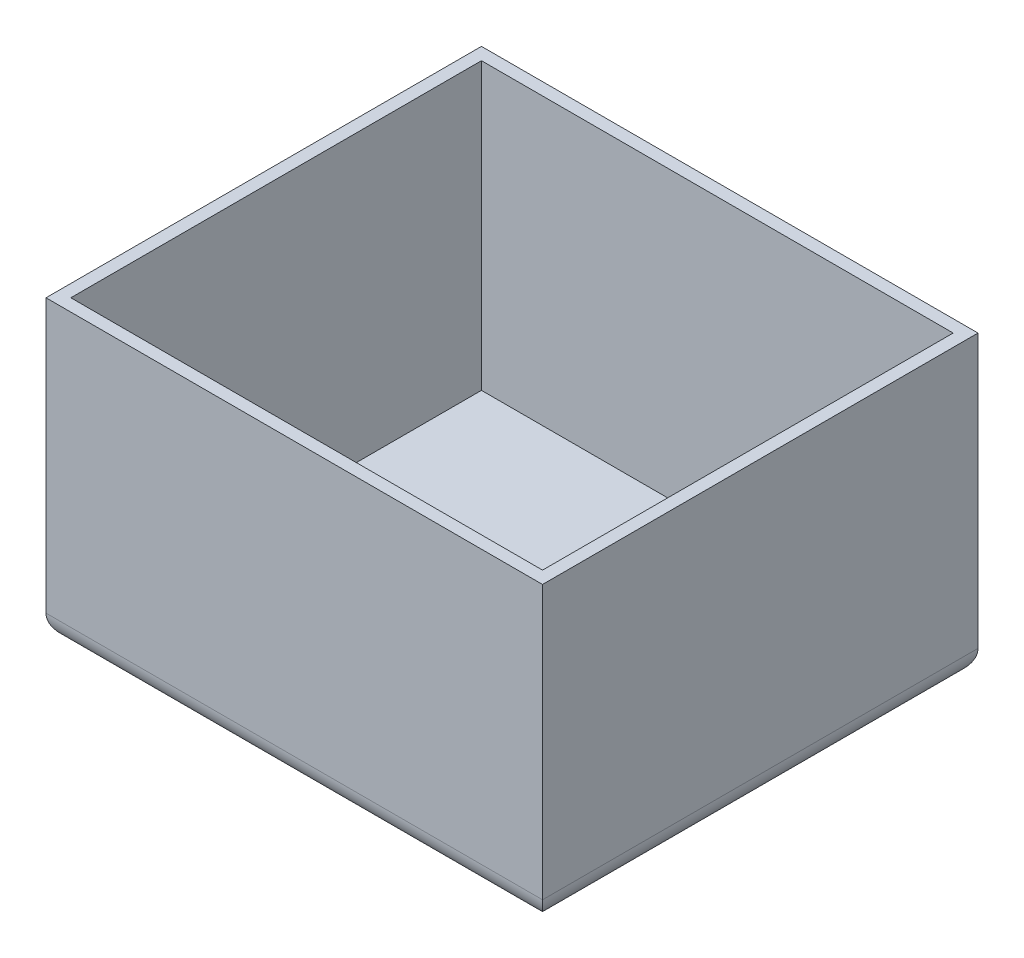
ISO-10303-21;
HEADER;
FILE_DESCRIPTION(('STEP AP214'),'2;1');
FILE_NAME('part.step','',(''),(''),'','','');
FILE_SCHEMA(('AUTOMOTIVE_DESIGN { 1 0 10303 214 1 1 1 1 }'));
ENDSEC;
DATA;
#1=APPLICATION_CONTEXT('core data for automotive mechanical design processes');
#2=APPLICATION_PROTOCOL_DEFINITION('international standard','automotive_design',2000,#1);
#3=PRODUCT_CONTEXT('',#1,'mechanical');
#4=PRODUCT('Part','Part','',(#3));
#5=PRODUCT_RELATED_PRODUCT_CATEGORY('part','',(#4));
#6=PRODUCT_DEFINITION_FORMATION('','',#4);
#7=PRODUCT_DEFINITION_CONTEXT('part definition',#1,'design');
#8=PRODUCT_DEFINITION('design','',#6,#7);
#9=PRODUCT_DEFINITION_SHAPE('','',#8);
#10=(LENGTH_UNIT() NAMED_UNIT(*) SI_UNIT(.MILLI.,.METRE.));
#11=(NAMED_UNIT(*) PLANE_ANGLE_UNIT() SI_UNIT($,.RADIAN.));
#12=(NAMED_UNIT(*) SI_UNIT($,.STERADIAN.) SOLID_ANGLE_UNIT());
#13=UNCERTAINTY_MEASURE_WITH_UNIT(LENGTH_MEASURE(1.E-05),#10,'distance_accuracy_value','');
#14=(GEOMETRIC_REPRESENTATION_CONTEXT(3) GLOBAL_UNCERTAINTY_ASSIGNED_CONTEXT((#13)) GLOBAL_UNIT_ASSIGNED_CONTEXT((#10,
#11,#12)) REPRESENTATION_CONTEXT('',''));
#15=CARTESIAN_POINT('',(0.,0.,0.));
#16=DIRECTION('',(0.,0.,1.));
#17=DIRECTION('',(1.,0.,0.));
#18=AXIS2_PLACEMENT_3D('',#15,#16,#17);
#19=CARTESIAN_POINT('',(0.,120.,175.4));
#20=DIRECTION('',(0.,-1.,0.));
#21=DIRECTION('',(0.,0.,-1.));
#22=AXIS2_PLACEMENT_3D('',#19,#20,#21);
#23=PLANE('',#22);
#24=DIRECTION('',(-1.,0.,0.));
#25=VECTOR('',#24,1.);
#26=CARTESIAN_POINT('',(0.,120.,0.));
#27=LINE('',#26,#25);
#28=CARTESIAN_POINT('',(200.,120.,0.));
#29=VERTEX_POINT('',#28);
#30=CARTESIAN_POINT('',(0.,120.,0.));
#31=VERTEX_POINT('',#30);
#32=EDGE_CURVE('E281',#29,#31,#27,.T.);
#33=ORIENTED_EDGE('',*,*,#32,.T.);
#34=DIRECTION('',(0.,0.,-1.));
#35=VECTOR('',#34,1.);
#36=CARTESIAN_POINT('',(0.,120.,175.4));
#37=LINE('',#36,#35);
#38=CARTESIAN_POINT('',(0.,120.,175.4));
#39=VERTEX_POINT('',#38);
#40=EDGE_CURVE('E285',#39,#31,#37,.T.);
#41=ORIENTED_EDGE('',*,*,#40,.F.);
#42=DIRECTION('',(-1.,0.,0.));
#43=VECTOR('',#42,1.);
#44=CARTESIAN_POINT('',(0.,120.,175.4));
#45=LINE('',#44,#43);
#46=CARTESIAN_POINT('',(200.,120.,175.4));
#47=VERTEX_POINT('',#46);
#48=EDGE_CURVE('E283',#47,#39,#45,.T.);
#49=ORIENTED_EDGE('',*,*,#48,.F.);
#50=DIRECTION('',(0.,0.,-1.));
#51=VECTOR('',#50,1.);
#52=CARTESIAN_POINT('',(200.,120.,175.4));
#53=LINE('',#52,#51);
#54=EDGE_CURVE('E293',#47,#29,#53,.T.);
#55=ORIENTED_EDGE('',*,*,#54,.T.);
#56=EDGE_LOOP('',(#33,#41,#49,#55));
#57=FACE_BOUND('',#56,.T.);
#58=DIRECTION('',(-1.,0.,0.));
#59=VECTOR('',#58,1.);
#60=CARTESIAN_POINT('',(0.,120.,5.));
#61=LINE('',#60,#59);
#62=CARTESIAN_POINT('',(195.,120.,5.));
#63=VERTEX_POINT('',#62);
#64=CARTESIAN_POINT('',(5.,120.,5.));
#65=VERTEX_POINT('',#64);
#66=EDGE_CURVE('E257',#63,#65,#61,.T.);
#67=ORIENTED_EDGE('',*,*,#66,.F.);
#68=DIRECTION('',(0.,0.,-1.));
#69=VECTOR('',#68,1.);
#70=CARTESIAN_POINT('',(195.,120.,175.4));
#71=LINE('',#70,#69);
#72=CARTESIAN_POINT('',(195.,120.,170.4));
#73=VERTEX_POINT('',#72);
#74=EDGE_CURVE('E262',#73,#63,#71,.T.);
#75=ORIENTED_EDGE('',*,*,#74,.F.);
#76=DIRECTION('',(-1.,0.,0.));
#77=VECTOR('',#76,1.);
#78=CARTESIAN_POINT('',(0.,120.,170.4));
#79=LINE('',#78,#77);
#80=CARTESIAN_POINT('',(5.,120.,170.4));
#81=VERTEX_POINT('',#80);
#82=EDGE_CURVE('E268',#73,#81,#79,.T.);
#83=ORIENTED_EDGE('',*,*,#82,.T.);
#84=DIRECTION('',(0.,0.,-1.));
#85=VECTOR('',#84,1.);
#86=CARTESIAN_POINT('',(5.,120.,175.4));
#87=LINE('',#86,#85);
#88=EDGE_CURVE('E269',#81,#65,#87,.T.);
#89=ORIENTED_EDGE('',*,*,#88,.T.);
#90=EDGE_LOOP('',(#67,#75,#83,#89));
#91=FACE_BOUND('',#90,.T.);
#92=ADVANCED_FACE('F41',(#57,#91),#23,.F.);
#93=CARTESIAN_POINT('',(0.,0.,175.4));
#94=DIRECTION('',(1.,0.,0.));
#95=DIRECTION('',(0.,0.,-1.));
#96=AXIS2_PLACEMENT_3D('',#93,#94,#95);
#97=PLANE('',#96);
#98=DIRECTION('',(0.,-1.,0.));
#99=VECTOR('',#98,1.);
#100=CARTESIAN_POINT('',(0.,0.,0.));
#101=LINE('',#100,#99);
#102=CARTESIAN_POINT('',(0.,10.,0.));
#103=VERTEX_POINT('',#102);
#104=EDGE_CURVE('E251',#31,#103,#101,.T.);
#105=ORIENTED_EDGE('',*,*,#104,.T.);
#106=DIRECTION('',(0.,0.,-1.));
#107=VECTOR('',#106,1.);
#108=CARTESIAN_POINT('',(0.,10.,175.4));
#109=LINE('',#108,#107);
#110=CARTESIAN_POINT('',(0.,10.,175.4));
#111=VERTEX_POINT('',#110);
#112=EDGE_CURVE('E319',#103,#111,#109,.F.);
#113=ORIENTED_EDGE('',*,*,#112,.T.);
#114=DIRECTION('',(0.,-1.,0.));
#115=VECTOR('',#114,1.);
#116=CARTESIAN_POINT('',(0.,0.,175.4));
#117=LINE('',#116,#115);
#118=EDGE_CURVE('E277',#39,#111,#117,.T.);
#119=ORIENTED_EDGE('',*,*,#118,.F.);
#120=ORIENTED_EDGE('',*,*,#40,.T.);
#121=EDGE_LOOP('',(#105,#113,#119,#120));
#122=FACE_BOUND('',#121,.T.);
#123=ADVANCED_FACE('F419',(#122),#97,.F.);
#124=CARTESIAN_POINT('',(0.,0.,175.4));
#125=DIRECTION('',(0.,1.,0.));
#126=DIRECTION('',(0.,0.,1.));
#127=AXIS2_PLACEMENT_3D('',#124,#125,#126);
#128=PLANE('',#127);
#129=DIRECTION('',(1.,0.,0.));
#130=VECTOR('',#129,1.);
#131=CARTESIAN_POINT('',(0.,0.,165.4));
#132=LINE('',#131,#130);
#133=CARTESIAN_POINT('',(190.,0.,165.4));
#134=VERTEX_POINT('',#133);
#135=CARTESIAN_POINT('',(10.,0.,165.4));
#136=VERTEX_POINT('',#135);
#137=EDGE_CURVE('E314',#134,#136,#132,.F.);
#138=ORIENTED_EDGE('',*,*,#137,.T.);
#139=DIRECTION('',(0.,0.,-1.));
#140=VECTOR('',#139,1.);
#141=CARTESIAN_POINT('',(10.,0.,175.4));
#142=LINE('',#141,#140);
#143=CARTESIAN_POINT('',(10.,0.,10.));
#144=VERTEX_POINT('',#143);
#145=EDGE_CURVE('E316',#136,#144,#142,.T.);
#146=ORIENTED_EDGE('',*,*,#145,.T.);
#147=DIRECTION('',(1.,0.,0.));
#148=VECTOR('',#147,1.);
#149=CARTESIAN_POINT('',(200.,0.,10.));
#150=LINE('',#149,#148);
#151=CARTESIAN_POINT('',(190.,0.,10.));
#152=VERTEX_POINT('',#151);
#153=EDGE_CURVE('E310',#144,#152,#150,.T.);
#154=ORIENTED_EDGE('',*,*,#153,.T.);
#155=DIRECTION('',(0.,0.,-1.));
#156=VECTOR('',#155,1.);
#157=CARTESIAN_POINT('',(190.,0.,175.4));
#158=LINE('',#157,#156);
#159=EDGE_CURVE('E312',#152,#134,#158,.F.);
#160=ORIENTED_EDGE('',*,*,#159,.T.);
#161=EDGE_LOOP('',(#138,#146,#154,#160));
#162=FACE_BOUND('',#161,.T.);
#163=DIRECTION('',(0.,0.,1.));
#164=VECTOR('',#163,1.);
#165=CARTESIAN_POINT('',(142.542212692304,0.,82.4026280979061));
#166=LINE('',#165,#164);
#167=CARTESIAN_POINT('',(142.542212692304,0.,103.514603163571));
#168=VERTEX_POINT('',#167);
#169=CARTESIAN_POINT('',(142.542212692304,0.,72.4026280979061));
#170=VERTEX_POINT('',#169);
#171=EDGE_CURVE('E305',#168,#170,#166,.F.);
#172=ORIENTED_EDGE('',*,*,#171,.T.);
#173=DIRECTION('',(1.,0.,0.));
#174=VECTOR('',#173,1.);
#175=CARTESIAN_POINT('',(66.6640748030059,0.,72.4026280979061));
#176=LINE('',#175,#174);
#177=CARTESIAN_POINT('',(56.6640748030059,0.,72.4026280979061));
#178=VERTEX_POINT('',#177);
#179=EDGE_CURVE('E307',#170,#178,#176,.F.);
#180=ORIENTED_EDGE('',*,*,#179,.T.);
#181=DIRECTION('',(0.,0.,1.));
#182=VECTOR('',#181,1.);
#183=CARTESIAN_POINT('',(56.6640748030059,0.,175.4));
#184=LINE('',#183,#182);
#185=CARTESIAN_POINT('',(56.6640748030059,0.,103.514603163571));
#186=VERTEX_POINT('',#185);
#187=EDGE_CURVE('E301',#178,#186,#184,.T.);
#188=ORIENTED_EDGE('',*,*,#187,.T.);
#189=DIRECTION('',(1.,0.,0.));
#190=VECTOR('',#189,1.);
#191=CARTESIAN_POINT('',(0.,0.,103.514603163571));
#192=LINE('',#191,#190);
#193=EDGE_CURVE('E303',#186,#168,#192,.T.);
#194=ORIENTED_EDGE('',*,*,#193,.T.);
#195=EDGE_LOOP('',(#172,#180,#188,#194));
#196=FACE_BOUND('',#195,.T.);
#197=ADVANCED_FACE('F381',(#162,#196),#128,.F.);
#198=CARTESIAN_POINT('',(200.,0.,175.4));
#199=DIRECTION('',(-1.,0.,0.));
#200=DIRECTION('',(0.,0.,1.));
#201=AXIS2_PLACEMENT_3D('',#198,#199,#200);
#202=PLANE('',#201);
#203=DIRECTION('',(0.,1.,0.));
#204=VECTOR('',#203,1.);
#205=CARTESIAN_POINT('',(200.,0.,175.4));
#206=LINE('',#205,#204);
#207=CARTESIAN_POINT('',(200.,10.,175.4));
#208=VERTEX_POINT('',#207);
#209=EDGE_CURVE('E280',#208,#47,#206,.T.);
#210=ORIENTED_EDGE('',*,*,#209,.F.);
#211=DIRECTION('',(0.,0.,-1.));
#212=VECTOR('',#211,1.);
#213=CARTESIAN_POINT('',(200.,10.,175.4));
#214=LINE('',#213,#212);
#215=CARTESIAN_POINT('',(200.,10.,0.));
#216=VERTEX_POINT('',#215);
#217=EDGE_CURVE('E324',#208,#216,#214,.T.);
#218=ORIENTED_EDGE('',*,*,#217,.T.);
#219=DIRECTION('',(0.,1.,0.));
#220=VECTOR('',#219,1.);
#221=CARTESIAN_POINT('',(200.,0.,0.));
#222=LINE('',#221,#220);
#223=EDGE_CURVE('E288',#216,#29,#222,.T.);
#224=ORIENTED_EDGE('',*,*,#223,.T.);
#225=ORIENTED_EDGE('',*,*,#54,.F.);
#226=EDGE_LOOP('',(#210,#218,#224,#225));
#227=FACE_BOUND('',#226,.T.);
#228=ADVANCED_FACE('F432',(#227),#202,.F.);
#229=CARTESIAN_POINT('',(0.,0.,175.4));
#230=DIRECTION('',(0.,0.,-1.));
#231=DIRECTION('',(-1.,0.,0.));
#232=AXIS2_PLACEMENT_3D('',#229,#230,#231);
#233=PLANE('',#232);
#234=ORIENTED_EDGE('',*,*,#118,.T.);
#235=DIRECTION('',(1.,0.,0.));
#236=VECTOR('',#235,1.);
#237=CARTESIAN_POINT('',(0.,10.,175.4));
#238=LINE('',#237,#236);
#239=EDGE_CURVE('E322',#111,#208,#238,.T.);
#240=ORIENTED_EDGE('',*,*,#239,.T.);
#241=ORIENTED_EDGE('',*,*,#209,.T.);
#242=ORIENTED_EDGE('',*,*,#48,.T.);
#243=EDGE_LOOP('',(#234,#240,#241,#242));
#244=FACE_BOUND('',#243,.T.);
#245=ADVANCED_FACE('F435',(#244),#233,.F.);
#246=CARTESIAN_POINT('',(0.,0.,0.));
#247=DIRECTION('',(0.,0.,-1.));
#248=DIRECTION('',(-1.,0.,0.));
#249=AXIS2_PLACEMENT_3D('',#246,#247,#248);
#250=PLANE('',#249);
#251=ORIENTED_EDGE('',*,*,#223,.F.);
#252=DIRECTION('',(1.,0.,0.));
#253=VECTOR('',#252,1.);
#254=CARTESIAN_POINT('',(0.,10.,0.));
#255=LINE('',#254,#253);
#256=EDGE_CURVE('E326',#216,#103,#255,.F.);
#257=ORIENTED_EDGE('',*,*,#256,.T.);
#258=ORIENTED_EDGE('',*,*,#104,.F.);
#259=ORIENTED_EDGE('',*,*,#32,.F.);
#260=EDGE_LOOP('',(#251,#257,#258,#259));
#261=FACE_BOUND('',#260,.T.);
#262=ADVANCED_FACE('F430',(#261),#250,.T.);
#263=CARTESIAN_POINT('',(5.,0.,175.4));
#264=DIRECTION('',(1.,0.,0.));
#265=DIRECTION('',(0.,0.,-1.));
#266=AXIS2_PLACEMENT_3D('',#263,#264,#265);
#267=PLANE('',#266);
#268=DIRECTION('',(0.,-1.,0.));
#269=VECTOR('',#268,1.);
#270=CARTESIAN_POINT('',(5.,0.,5.));
#271=LINE('',#270,#269);
#272=CARTESIAN_POINT('',(5.,5.,5.));
#273=VERTEX_POINT('',#272);
#274=EDGE_CURVE('E237',#65,#273,#271,.T.);
#275=ORIENTED_EDGE('',*,*,#274,.F.);
#276=ORIENTED_EDGE('',*,*,#88,.F.);
#277=DIRECTION('',(0.,-1.,0.));
#278=VECTOR('',#277,1.);
#279=CARTESIAN_POINT('',(5.,0.,170.4));
#280=LINE('',#279,#278);
#281=CARTESIAN_POINT('',(5.,5.,170.4));
#282=VERTEX_POINT('',#281);
#283=EDGE_CURVE('E253',#81,#282,#280,.T.);
#284=ORIENTED_EDGE('',*,*,#283,.T.);
#285=DIRECTION('',(0.,0.,-1.));
#286=VECTOR('',#285,1.);
#287=CARTESIAN_POINT('',(5.,5.,175.4));
#288=LINE('',#287,#286);
#289=EDGE_CURVE('E248',#282,#273,#288,.T.);
#290=ORIENTED_EDGE('',*,*,#289,.T.);
#291=EDGE_LOOP('',(#275,#276,#284,#290));
#292=FACE_BOUND('',#291,.T.);
#293=ADVANCED_FACE('F551',(#292),#267,.T.);
#294=CARTESIAN_POINT('',(0.,5.,175.4));
#295=DIRECTION('',(0.,1.,0.));
#296=DIRECTION('',(0.,0.,1.));
#297=AXIS2_PLACEMENT_3D('',#294,#295,#296);
#298=PLANE('',#297);
#299=DIRECTION('',(1.,0.,0.));
#300=VECTOR('',#299,1.);
#301=CARTESIAN_POINT('',(0.,5.,5.));
#302=LINE('',#301,#300);
#303=CARTESIAN_POINT('',(195.,5.,5.));
#304=VERTEX_POINT('',#303);
#305=EDGE_CURVE('E247',#273,#304,#302,.T.);
#306=ORIENTED_EDGE('',*,*,#305,.F.);
#307=ORIENTED_EDGE('',*,*,#289,.F.);
#308=DIRECTION('',(1.,0.,0.));
#309=VECTOR('',#308,1.);
#310=CARTESIAN_POINT('',(0.,5.,170.4));
#311=LINE('',#310,#309);
#312=CARTESIAN_POINT('',(195.,5.,170.4));
#313=VERTEX_POINT('',#312);
#314=EDGE_CURVE('E256',#282,#313,#311,.T.);
#315=ORIENTED_EDGE('',*,*,#314,.T.);
#316=DIRECTION('',(0.,0.,-1.));
#317=VECTOR('',#316,1.);
#318=CARTESIAN_POINT('',(195.,5.,175.4));
#319=LINE('',#318,#317);
#320=EDGE_CURVE('E252',#313,#304,#319,.T.);
#321=ORIENTED_EDGE('',*,*,#320,.T.);
#322=EDGE_LOOP('',(#306,#307,#315,#321));
#323=FACE_BOUND('',#322,.T.);
#324=ADVANCED_FACE('F588',(#323),#298,.T.);
#325=CARTESIAN_POINT('',(195.,0.,175.4));
#326=DIRECTION('',(-1.,0.,0.));
#327=DIRECTION('',(0.,0.,1.));
#328=AXIS2_PLACEMENT_3D('',#325,#326,#327);
#329=PLANE('',#328);
#330=DIRECTION('',(0.,1.,0.));
#331=VECTOR('',#330,1.);
#332=CARTESIAN_POINT('',(195.,0.,5.));
#333=LINE('',#332,#331);
#334=EDGE_CURVE('E259',#304,#63,#333,.T.);
#335=ORIENTED_EDGE('',*,*,#334,.F.);
#336=ORIENTED_EDGE('',*,*,#320,.F.);
#337=DIRECTION('',(0.,1.,0.));
#338=VECTOR('',#337,1.);
#339=CARTESIAN_POINT('',(195.,0.,170.4));
#340=LINE('',#339,#338);
#341=EDGE_CURVE('E264',#313,#73,#340,.T.);
#342=ORIENTED_EDGE('',*,*,#341,.T.);
#343=ORIENTED_EDGE('',*,*,#74,.T.);
#344=EDGE_LOOP('',(#335,#336,#342,#343));
#345=FACE_BOUND('',#344,.T.);
#346=ADVANCED_FACE('F598',(#345),#329,.T.);
#347=CARTESIAN_POINT('',(0.,0.,170.4));
#348=DIRECTION('',(0.,0.,-1.));
#349=DIRECTION('',(-1.,0.,0.));
#350=AXIS2_PLACEMENT_3D('',#347,#348,#349);
#351=PLANE('',#350);
#352=ORIENTED_EDGE('',*,*,#283,.F.);
#353=ORIENTED_EDGE('',*,*,#82,.F.);
#354=ORIENTED_EDGE('',*,*,#341,.F.);
#355=ORIENTED_EDGE('',*,*,#314,.F.);
#356=EDGE_LOOP('',(#352,#353,#354,#355));
#357=FACE_BOUND('',#356,.T.);
#358=ADVANCED_FACE('F608',(#357),#351,.T.);
#359=CARTESIAN_POINT('',(0.,0.,5.));
#360=DIRECTION('',(0.,0.,-1.));
#361=DIRECTION('',(-1.,0.,0.));
#362=AXIS2_PLACEMENT_3D('',#359,#360,#361);
#363=PLANE('',#362);
#364=ORIENTED_EDGE('',*,*,#274,.T.);
#365=ORIENTED_EDGE('',*,*,#305,.T.);
#366=ORIENTED_EDGE('',*,*,#334,.T.);
#367=ORIENTED_EDGE('',*,*,#66,.T.);
#368=EDGE_LOOP('',(#364,#365,#366,#367));
#369=FACE_BOUND('',#368,.T.);
#370=ADVANCED_FACE('F541',(#369),#363,.F.);
#371=CARTESIAN_POINT('',(66.6640748030059,-25.,93.5146031635708));
#372=DIRECTION('',(0.,0.,1.));
#373=DIRECTION('',(1.,0.,0.));
#374=AXIS2_PLACEMENT_3D('',#371,#372,#373);
#375=PLANE('',#374);
#376=DIRECTION('',(0.,1.,0.));
#377=VECTOR('',#376,1.);
#378=CARTESIAN_POINT('',(132.542212692304,-25.,93.5146031635708));
#379=LINE('',#378,#377);
#380=CARTESIAN_POINT('',(132.542212692304,-25.,93.5146031635708));
#381=VERTEX_POINT('',#380);
#382=CARTESIAN_POINT('',(132.542212692304,-10.,93.5146031635708));
#383=VERTEX_POINT('',#382);
#384=EDGE_CURVE('E233',#381,#383,#379,.T.);
#385=ORIENTED_EDGE('',*,*,#384,.T.);
#386=DIRECTION('',(1.,0.,0.));
#387=VECTOR('',#386,1.);
#388=CARTESIAN_POINT('',(66.6640748030059,-10.,93.5146031635708));
#389=LINE('',#388,#387);
#390=CARTESIAN_POINT('',(128.582824740776,-10.,93.5146031635708));
#391=VERTEX_POINT('',#390);
#392=EDGE_CURVE('E216',#383,#391,#389,.F.);
#393=ORIENTED_EDGE('',*,*,#392,.T.);
#394=DIRECTION('',(0.,1.,0.));
#395=VECTOR('',#394,1.);
#396=CARTESIAN_POINT('',(128.582824740776,-3.71555235478723,93.5146031635708));
#397=LINE('',#396,#395);
#398=CARTESIAN_POINT('',(128.582824740776,-20.0767554822657,93.5146031635708));
#399=VERTEX_POINT('',#398);
#400=EDGE_CURVE('E195',#399,#391,#397,.T.);
#401=ORIENTED_EDGE('',*,*,#400,.F.);
#402=DIRECTION('',(1.,0.,0.));
#403=VECTOR('',#402,1.);
#404=CARTESIAN_POINT('',(70.8258064714842,-20.0767554822657,93.5146031635708));
#405=LINE('',#404,#403);
#406=CARTESIAN_POINT('',(70.8258064714842,-20.0767554822657,93.5146031635708));
#407=VERTEX_POINT('',#406);
#408=EDGE_CURVE('E206',#407,#399,#405,.T.);
#409=ORIENTED_EDGE('',*,*,#408,.F.);
#410=DIRECTION('',(0.,-1.,0.));
#411=VECTOR('',#410,1.);
#412=CARTESIAN_POINT('',(70.8258064714842,-3.71555235478723,93.5146031635708));
#413=LINE('',#412,#411);
#414=CARTESIAN_POINT('',(70.8258064714842,-10.,93.5146031635708));
#415=VERTEX_POINT('',#414);
#416=EDGE_CURVE('E211',#415,#407,#413,.T.);
#417=ORIENTED_EDGE('',*,*,#416,.F.);
#418=DIRECTION('',(1.,0.,0.));
#419=VECTOR('',#418,1.);
#420=CARTESIAN_POINT('',(66.6640748030059,-10.,93.5146031635708));
#421=LINE('',#420,#419);
#422=CARTESIAN_POINT('',(66.6640748030059,-10.,93.5146031635708));
#423=VERTEX_POINT('',#422);
#424=EDGE_CURVE('E335',#415,#423,#421,.F.);
#425=ORIENTED_EDGE('',*,*,#424,.T.);
#426=DIRECTION('',(0.,1.,0.));
#427=VECTOR('',#426,1.);
#428=CARTESIAN_POINT('',(66.6640748030059,-25.,93.5146031635708));
#429=LINE('',#428,#427);
#430=CARTESIAN_POINT('',(66.6640748030059,-25.,93.5146031635708));
#431=VERTEX_POINT('',#430);
#432=EDGE_CURVE('E234',#431,#423,#429,.T.);
#433=ORIENTED_EDGE('',*,*,#432,.F.);
#434=DIRECTION('',(1.,0.,0.));
#435=VECTOR('',#434,1.);
#436=CARTESIAN_POINT('',(66.6640748030059,-25.,93.5146031635708));
#437=LINE('',#436,#435);
#438=EDGE_CURVE('E222',#431,#381,#437,.T.);
#439=ORIENTED_EDGE('',*,*,#438,.T.);
#440=EDGE_LOOP('',(#385,#393,#401,#409,#417,#425,#433,#439));
#441=FACE_BOUND('',#440,.T.);
#442=ADVANCED_FACE('F214',(#441),#375,.T.);
#443=CARTESIAN_POINT('',(66.6640748030059,-25.,82.4026280979061));
#444=DIRECTION('',(-1.,0.,0.));
#445=DIRECTION('',(0.,0.,1.));
#446=AXIS2_PLACEMENT_3D('',#443,#444,#445);
#447=PLANE('',#446);
#448=ORIENTED_EDGE('',*,*,#432,.T.);
#449=DIRECTION('',(0.,0.,1.));
#450=VECTOR('',#449,1.);
#451=CARTESIAN_POINT('',(66.6640748030059,-10.,82.4026280979061));
#452=LINE('',#451,#450);
#453=CARTESIAN_POINT('',(66.6640748030059,-10.,82.4026280979061));
#454=VERTEX_POINT('',#453);
#455=EDGE_CURVE('E338',#423,#454,#452,.F.);
#456=ORIENTED_EDGE('',*,*,#455,.T.);
#457=DIRECTION('',(0.,1.,0.));
#458=VECTOR('',#457,1.);
#459=CARTESIAN_POINT('',(66.6640748030059,-25.,82.4026280979061));
#460=LINE('',#459,#458);
#461=CARTESIAN_POINT('',(66.6640748030059,-25.,82.4026280979061));
#462=VERTEX_POINT('',#461);
#463=EDGE_CURVE('E238',#462,#454,#460,.T.);
#464=ORIENTED_EDGE('',*,*,#463,.F.);
#465=DIRECTION('',(0.,0.,1.));
#466=VECTOR('',#465,1.);
#467=CARTESIAN_POINT('',(66.6640748030059,-25.,82.4026280979061));
#468=LINE('',#467,#466);
#469=EDGE_CURVE('E230',#462,#431,#468,.T.);
#470=ORIENTED_EDGE('',*,*,#469,.T.);
#471=EDGE_LOOP('',(#448,#456,#464,#470));
#472=FACE_BOUND('',#471,.T.);
#473=ADVANCED_FACE('F405',(#472),#447,.T.);
#474=CARTESIAN_POINT('',(66.6640748030059,-25.,82.4026280979061));
#475=DIRECTION('',(0.,0.,1.));
#476=DIRECTION('',(1.,0.,0.));
#477=AXIS2_PLACEMENT_3D('',#474,#475,#476);
#478=PLANE('',#477);
#479=ORIENTED_EDGE('',*,*,#463,.T.);
#480=DIRECTION('',(1.,0.,0.));
#481=VECTOR('',#480,1.);
#482=CARTESIAN_POINT('',(132.542212692304,-10.,82.4026280979061));
#483=LINE('',#482,#481);
#484=CARTESIAN_POINT('',(70.8258064714842,-10.,82.4026280979061));
#485=VERTEX_POINT('',#484);
#486=EDGE_CURVE('E330',#454,#485,#483,.T.);
#487=ORIENTED_EDGE('',*,*,#486,.T.);
#488=DIRECTION('',(0.,-1.,0.));
#489=VECTOR('',#488,1.);
#490=CARTESIAN_POINT('',(70.8258064714842,-25.,82.4026280979061));
#491=LINE('',#490,#489);
#492=CARTESIAN_POINT('',(70.8258064714842,-20.0767554822657,82.4026280979061));
#493=VERTEX_POINT('',#492);
#494=EDGE_CURVE('E299',#485,#493,#491,.T.);
#495=ORIENTED_EDGE('',*,*,#494,.T.);
#496=DIRECTION('',(1.,0.,0.));
#497=VECTOR('',#496,1.);
#498=CARTESIAN_POINT('',(66.6640748030059,-20.0767554822657,82.4026280979061));
#499=LINE('',#498,#497);
#500=CARTESIAN_POINT('',(128.582824740776,-20.0767554822657,82.4026280979061));
#501=VERTEX_POINT('',#500);
#502=EDGE_CURVE('E296',#493,#501,#499,.T.);
#503=ORIENTED_EDGE('',*,*,#502,.T.);
#504=DIRECTION('',(0.,1.,0.));
#505=VECTOR('',#504,1.);
#506=CARTESIAN_POINT('',(128.582824740776,-25.,82.4026280979061));
#507=LINE('',#506,#505);
#508=CARTESIAN_POINT('',(128.582824740776,-10.,82.4026280979061));
#509=VERTEX_POINT('',#508);
#510=EDGE_CURVE('E198',#501,#509,#507,.T.);
#511=ORIENTED_EDGE('',*,*,#510,.T.);
#512=DIRECTION('',(1.,0.,0.));
#513=VECTOR('',#512,1.);
#514=CARTESIAN_POINT('',(132.542212692304,-10.,82.4026280979061));
#515=LINE('',#514,#513);
#516=CARTESIAN_POINT('',(132.542212692304,-10.,82.4026280979061));
#517=VERTEX_POINT('',#516);
#518=EDGE_CURVE('E328',#509,#517,#515,.T.);
#519=ORIENTED_EDGE('',*,*,#518,.T.);
#520=DIRECTION('',(0.,1.,0.));
#521=VECTOR('',#520,1.);
#522=CARTESIAN_POINT('',(132.542212692304,-25.,82.4026280979061));
#523=LINE('',#522,#521);
#524=CARTESIAN_POINT('',(132.542212692304,-25.,82.4026280979061));
#525=VERTEX_POINT('',#524);
#526=EDGE_CURVE('E241',#525,#517,#523,.T.);
#527=ORIENTED_EDGE('',*,*,#526,.F.);
#528=DIRECTION('',(1.,0.,0.));
#529=VECTOR('',#528,1.);
#530=CARTESIAN_POINT('',(66.6640748030059,-25.,82.4026280979061));
#531=LINE('',#530,#529);
#532=EDGE_CURVE('E228',#462,#525,#531,.T.);
#533=ORIENTED_EDGE('',*,*,#532,.F.);
#534=EDGE_LOOP('',(#479,#487,#495,#503,#511,#519,#527,#533));
#535=FACE_BOUND('',#534,.T.);
#536=ADVANCED_FACE('F400',(#535),#478,.F.);
#537=CARTESIAN_POINT('',(132.542212692304,-25.,82.4026280979061));
#538=DIRECTION('',(-1.,0.,0.));
#539=DIRECTION('',(0.,0.,1.));
#540=AXIS2_PLACEMENT_3D('',#537,#538,#539);
#541=PLANE('',#540);
#542=ORIENTED_EDGE('',*,*,#526,.T.);
#543=DIRECTION('',(0.,0.,1.));
#544=VECTOR('',#543,1.);
#545=CARTESIAN_POINT('',(132.542212692304,-10.,93.5146031635708));
#546=LINE('',#545,#544);
#547=EDGE_CURVE('E333',#517,#383,#546,.T.);
#548=ORIENTED_EDGE('',*,*,#547,.T.);
#549=ORIENTED_EDGE('',*,*,#384,.F.);
#550=DIRECTION('',(0.,0.,1.));
#551=VECTOR('',#550,1.);
#552=CARTESIAN_POINT('',(132.542212692304,-25.,82.4026280979061));
#553=LINE('',#552,#551);
#554=EDGE_CURVE('E226',#525,#381,#553,.T.);
#555=ORIENTED_EDGE('',*,*,#554,.F.);
#556=EDGE_LOOP('',(#542,#548,#549,#555));
#557=FACE_BOUND('',#556,.T.);
#558=ADVANCED_FACE('F391',(#557),#541,.F.);
#559=CARTESIAN_POINT('',(0.,-25.,0.));
#560=DIRECTION('',(0.,-1.,0.));
#561=DIRECTION('',(0.,0.,-1.));
#562=AXIS2_PLACEMENT_3D('',#559,#560,#561);
#563=PLANE('',#562);
#564=ORIENTED_EDGE('',*,*,#438,.F.);
#565=ORIENTED_EDGE('',*,*,#469,.F.);
#566=ORIENTED_EDGE('',*,*,#532,.T.);
#567=ORIENTED_EDGE('',*,*,#554,.T.);
#568=EDGE_LOOP('',(#564,#565,#566,#567));
#569=FACE_BOUND('',#568,.T.);
#570=ADVANCED_FACE('F408',(#569),#563,.T.);
#571=CARTESIAN_POINT('',(70.8258064714842,-3.71555235478723,80.5146031635708));
#572=DIRECTION('',(-1.,0.,0.));
#573=DIRECTION('',(0.,0.,1.));
#574=AXIS2_PLACEMENT_3D('',#571,#572,#573);
#575=PLANE('',#574);
#576=DIRECTION('',(0.,0.,1.));
#577=VECTOR('',#576,1.);
#578=CARTESIAN_POINT('',(70.8258064714842,-3.71555235478723,80.5146031635708));
#579=LINE('',#578,#577);
#580=CARTESIAN_POINT('',(70.8258064714842,-3.71555235478723,80.1811702360307));
#581=VERTEX_POINT('',#580);
#582=CARTESIAN_POINT('',(70.8258064714842,-3.71555235478723,95.7360610254462));
#583=VERTEX_POINT('',#582);
#584=EDGE_CURVE('E57',#581,#583,#579,.T.);
#585=ORIENTED_EDGE('',*,*,#584,.T.);
#586=CARTESIAN_POINT('',(70.8258064714842,-10.,103.514603163571));
#587=DIRECTION('',(-1.,0.,0.));
#588=DIRECTION('',(0.,0.,1.));
#589=AXIS2_PLACEMENT_3D('',#586,#587,#588);
#590=CIRCLE('',#589,10.);
#591=EDGE_CURVE('E11',#583,#415,#590,.T.);
#592=ORIENTED_EDGE('',*,*,#591,.T.);
#593=ORIENTED_EDGE('',*,*,#416,.T.);
#594=DIRECTION('',(0.,0.,1.));
#595=VECTOR('',#594,1.);
#596=CARTESIAN_POINT('',(70.8258064714842,-20.0767554822657,80.5146031635708));
#597=LINE('',#596,#595);
#598=EDGE_CURVE('E202',#493,#407,#597,.T.);
#599=ORIENTED_EDGE('',*,*,#598,.F.);
#600=ORIENTED_EDGE('',*,*,#494,.F.);
#601=CARTESIAN_POINT('',(70.8258064714842,-10.,72.4026280979061));
#602=DIRECTION('',(-1.,0.,0.));
#603=DIRECTION('',(0.,0.,1.));
#604=AXIS2_PLACEMENT_3D('',#601,#602,#603);
#605=CIRCLE('',#604,10.);
#606=EDGE_CURVE('E340',#485,#581,#605,.T.);
#607=ORIENTED_EDGE('',*,*,#606,.T.);
#608=EDGE_LOOP('',(#585,#592,#593,#599,#600,#607));
#609=FACE_BOUND('',#608,.T.);
#610=ADVANCED_FACE('F403',(#609),#575,.F.);
#611=CARTESIAN_POINT('',(70.8258064714842,-3.71555235478723,80.5146031635708));
#612=DIRECTION('',(0.,1.,0.));
#613=DIRECTION('',(0.,0.,1.));
#614=AXIS2_PLACEMENT_3D('',#611,#612,#613);
#615=PLANE('',#614);
#616=DIRECTION('',(0.,0.,1.));
#617=VECTOR('',#616,1.);
#618=CARTESIAN_POINT('',(128.582824740776,-3.71555235478723,80.5146031635708));
#619=LINE('',#618,#617);
#620=CARTESIAN_POINT('',(128.582824740776,-3.71555235478723,80.1811702360307));
#621=VERTEX_POINT('',#620);
#622=CARTESIAN_POINT('',(128.582824740776,-3.71555235478723,95.7360610254462));
#623=VERTEX_POINT('',#622);
#624=EDGE_CURVE('E64',#621,#623,#619,.T.);
#625=ORIENTED_EDGE('',*,*,#624,.T.);
#626=DIRECTION('',(1.,0.,0.));
#627=VECTOR('',#626,1.);
#628=CARTESIAN_POINT('',(128.582824740776,-3.71555235478723,95.7360610254462));
#629=LINE('',#628,#627);
#630=EDGE_CURVE('E50',#623,#583,#629,.F.);
#631=ORIENTED_EDGE('',*,*,#630,.T.);
#632=ORIENTED_EDGE('',*,*,#584,.F.);
#633=DIRECTION('',(-1.,0.,0.));
#634=VECTOR('',#633,1.);
#635=CARTESIAN_POINT('',(70.8258064714842,-3.71555235478723,80.1811702360307));
#636=LINE('',#635,#634);
#637=EDGE_CURVE('E342',#581,#621,#636,.F.);
#638=ORIENTED_EDGE('',*,*,#637,.T.);
#639=EDGE_LOOP('',(#625,#631,#632,#638));
#640=FACE_BOUND('',#639,.T.);
#641=ADVANCED_FACE('F398',(#640),#615,.F.);
#642=CARTESIAN_POINT('',(128.582824740776,-3.71555235478723,80.5146031635708));
#643=DIRECTION('',(1.,0.,0.));
#644=DIRECTION('',(0.,0.,-1.));
#645=AXIS2_PLACEMENT_3D('',#642,#643,#644);
#646=PLANE('',#645);
#647=DIRECTION('',(0.,0.,1.));
#648=VECTOR('',#647,1.);
#649=CARTESIAN_POINT('',(128.582824740776,-20.0767554822657,80.5146031635708));
#650=LINE('',#649,#648);
#651=EDGE_CURVE('E191',#501,#399,#650,.T.);
#652=ORIENTED_EDGE('',*,*,#651,.T.);
#653=ORIENTED_EDGE('',*,*,#400,.T.);
#654=CARTESIAN_POINT('',(128.582824740776,-10.,103.514603163571));
#655=DIRECTION('',(1.,0.,0.));
#656=DIRECTION('',(0.,0.,-1.));
#657=AXIS2_PLACEMENT_3D('',#654,#655,#656);
#658=CIRCLE('',#657,10.);
#659=EDGE_CURVE('E346',#391,#623,#658,.T.);
#660=ORIENTED_EDGE('',*,*,#659,.T.);
#661=ORIENTED_EDGE('',*,*,#624,.F.);
#662=CARTESIAN_POINT('',(128.582824740776,-10.,72.4026280979061));
#663=DIRECTION('',(1.,0.,0.));
#664=DIRECTION('',(0.,0.,-1.));
#665=AXIS2_PLACEMENT_3D('',#662,#663,#664);
#666=CIRCLE('',#665,10.);
#667=EDGE_CURVE('E344',#621,#509,#666,.T.);
#668=ORIENTED_EDGE('',*,*,#667,.T.);
#669=ORIENTED_EDGE('',*,*,#510,.F.);
#670=EDGE_LOOP('',(#652,#653,#660,#661,#668,#669));
#671=FACE_BOUND('',#670,.T.);
#672=ADVANCED_FACE('F193',(#671),#646,.F.);
#673=CARTESIAN_POINT('',(70.8258064714842,-20.0767554822657,80.5146031635708));
#674=DIRECTION('',(0.,-1.,0.));
#675=DIRECTION('',(0.,0.,-1.));
#676=AXIS2_PLACEMENT_3D('',#673,#674,#675);
#677=PLANE('',#676);
#678=ORIENTED_EDGE('',*,*,#598,.T.);
#679=ORIENTED_EDGE('',*,*,#408,.T.);
#680=ORIENTED_EDGE('',*,*,#651,.F.);
#681=ORIENTED_EDGE('',*,*,#502,.F.);
#682=EDGE_LOOP('',(#678,#679,#680,#681));
#683=FACE_BOUND('',#682,.T.);
#684=ADVANCED_FACE('F207',(#683),#677,.F.);
#685=CARTESIAN_POINT('',(190.,10.,175.4));
#686=DIRECTION('',(0.,0.,-1.));
#687=DIRECTION('',(-1.,0.,0.));
#688=AXIS2_PLACEMENT_3D('',#685,#686,#687);
#689=CYLINDRICAL_SURFACE('',#688,10.);
#690=CARTESIAN_POINT('',(190.,10.,10.));
#691=DIRECTION('',(-0.707106781186547,0.,-0.707106781186547));
#692=DIRECTION('',(-0.707106781186547,0.,0.707106781186547));
#693=AXIS2_PLACEMENT_3D('',#690,#691,#692);
#694=ELLIPSE('',#693,14.1421356237309,10.);
#695=EDGE_CURVE('E353',#216,#152,#694,.T.);
#696=ORIENTED_EDGE('',*,*,#695,.F.);
#697=ORIENTED_EDGE('',*,*,#217,.F.);
#698=CARTESIAN_POINT('',(190.,10.,165.4));
#699=DIRECTION('',(0.707106781186547,0.,-0.707106781186547));
#700=DIRECTION('',(-0.707106781186547,0.,-0.707106781186547));
#701=AXIS2_PLACEMENT_3D('',#698,#699,#700);
#702=ELLIPSE('',#701,14.1421356237309,10.);
#703=EDGE_CURVE('E356',#134,#208,#702,.F.);
#704=ORIENTED_EDGE('',*,*,#703,.F.);
#705=ORIENTED_EDGE('',*,*,#159,.F.);
#706=EDGE_LOOP('',(#696,#697,#704,#705));
#707=FACE_BOUND('',#706,.T.);
#708=ADVANCED_FACE('F451',(#707),#689,.T.);
#709=CARTESIAN_POINT('',(0.,10.,165.4));
#710=DIRECTION('',(1.,0.,0.));
#711=DIRECTION('',(0.,0.,-1.));
#712=AXIS2_PLACEMENT_3D('',#709,#710,#711);
#713=CYLINDRICAL_SURFACE('',#712,10.);
#714=ORIENTED_EDGE('',*,*,#703,.T.);
#715=ORIENTED_EDGE('',*,*,#239,.F.);
#716=CARTESIAN_POINT('',(10.,10.,165.4));
#717=DIRECTION('',(0.707106781186547,0.,0.707106781186547));
#718=DIRECTION('',(0.707106781186547,0.,-0.707106781186547));
#719=AXIS2_PLACEMENT_3D('',#716,#717,#718);
#720=ELLIPSE('',#719,14.1421356237309,10.);
#721=EDGE_CURVE('E351',#136,#111,#720,.F.);
#722=ORIENTED_EDGE('',*,*,#721,.F.);
#723=ORIENTED_EDGE('',*,*,#137,.F.);
#724=EDGE_LOOP('',(#714,#715,#722,#723));
#725=FACE_BOUND('',#724,.T.);
#726=ADVANCED_FACE('F447',(#725),#713,.T.);
#727=CARTESIAN_POINT('',(0.,10.,10.));
#728=DIRECTION('',(-1.,0.,0.));
#729=DIRECTION('',(0.,0.,1.));
#730=AXIS2_PLACEMENT_3D('',#727,#728,#729);
#731=CYLINDRICAL_SURFACE('',#730,10.);
#732=ORIENTED_EDGE('',*,*,#695,.T.);
#733=ORIENTED_EDGE('',*,*,#153,.F.);
#734=CARTESIAN_POINT('',(10.,10.,10.));
#735=DIRECTION('',(-0.707106781186547,0.,0.707106781186547));
#736=DIRECTION('',(-0.707106781186547,0.,-0.707106781186547));
#737=AXIS2_PLACEMENT_3D('',#734,#735,#736);
#738=ELLIPSE('',#737,14.1421356237309,10.);
#739=EDGE_CURVE('E349',#103,#144,#738,.T.);
#740=ORIENTED_EDGE('',*,*,#739,.F.);
#741=ORIENTED_EDGE('',*,*,#256,.F.);
#742=EDGE_LOOP('',(#732,#733,#740,#741));
#743=FACE_BOUND('',#742,.T.);
#744=ADVANCED_FACE('F443',(#743),#731,.T.);
#745=CARTESIAN_POINT('',(10.,10.,175.4));
#746=DIRECTION('',(0.,0.,-1.));
#747=DIRECTION('',(-1.,0.,0.));
#748=AXIS2_PLACEMENT_3D('',#745,#746,#747);
#749=CYLINDRICAL_SURFACE('',#748,10.);
#750=ORIENTED_EDGE('',*,*,#721,.T.);
#751=ORIENTED_EDGE('',*,*,#112,.F.);
#752=ORIENTED_EDGE('',*,*,#739,.T.);
#753=ORIENTED_EDGE('',*,*,#145,.F.);
#754=EDGE_LOOP('',(#750,#751,#752,#753));
#755=FACE_BOUND('',#754,.T.);
#756=ADVANCED_FACE('F440',(#755),#749,.T.);
#757=CARTESIAN_POINT('',(0.,-10.,103.514603163571));
#758=DIRECTION('',(1.,0.,0.));
#759=DIRECTION('',(0.,0.,-1.));
#760=AXIS2_PLACEMENT_3D('',#757,#758,#759);
#761=CYLINDRICAL_SURFACE('',#760,10.);
#762=CARTESIAN_POINT('',(142.542212692304,-10.,103.514603163571));
#763=DIRECTION('',(0.707106781186547,0.,-0.707106781186547));
#764=DIRECTION('',(0.707106781186547,0.,0.707106781186547));
#765=AXIS2_PLACEMENT_3D('',#762,#763,#764);
#766=ELLIPSE('',#765,14.1421356237309,10.);
#767=EDGE_CURVE('E363',#168,#383,#766,.F.);
#768=ORIENTED_EDGE('',*,*,#767,.F.);
#769=ORIENTED_EDGE('',*,*,#193,.F.);
#770=CARTESIAN_POINT('',(56.6640748030059,-10.,103.514603163571));
#771=DIRECTION('',(0.707106781186547,0.,0.707106781186547));
#772=DIRECTION('',(-0.707106781186547,0.,0.707106781186547));
#773=AXIS2_PLACEMENT_3D('',#770,#771,#772);
#774=ELLIPSE('',#773,14.1421356237309,10.);
#775=EDGE_CURVE('E45',#423,#186,#774,.T.);
#776=ORIENTED_EDGE('',*,*,#775,.F.);
#777=ORIENTED_EDGE('',*,*,#424,.F.);
#778=ORIENTED_EDGE('',*,*,#591,.F.);
#779=ORIENTED_EDGE('',*,*,#630,.F.);
#780=ORIENTED_EDGE('',*,*,#659,.F.);
#781=ORIENTED_EDGE('',*,*,#392,.F.);
#782=EDGE_LOOP('',(#768,#769,#776,#777,#778,#779,#780,#781));
#783=FACE_BOUND('',#782,.T.);
#784=ADVANCED_FACE('F43',(#783),#761,.F.);
#785=CARTESIAN_POINT('',(56.6640748030059,-10.,175.4));
#786=DIRECTION('',(0.,0.,1.));
#787=DIRECTION('',(1.,0.,0.));
#788=AXIS2_PLACEMENT_3D('',#785,#786,#787);
#789=CYLINDRICAL_SURFACE('',#788,10.);
#790=ORIENTED_EDGE('',*,*,#775,.T.);
#791=ORIENTED_EDGE('',*,*,#187,.F.);
#792=CARTESIAN_POINT('',(56.6640748030059,-10.,72.4026280979061));
#793=DIRECTION('',(-0.707106781186547,0.,0.707106781186547));
#794=DIRECTION('',(0.707106781186547,0.,0.707106781186547));
#795=AXIS2_PLACEMENT_3D('',#792,#793,#794);
#796=ELLIPSE('',#795,14.1421356237309,10.);
#797=EDGE_CURVE('E362',#454,#178,#796,.T.);
#798=ORIENTED_EDGE('',*,*,#797,.F.);
#799=ORIENTED_EDGE('',*,*,#455,.F.);
#800=EDGE_LOOP('',(#790,#791,#798,#799));
#801=FACE_BOUND('',#800,.T.);
#802=ADVANCED_FACE('F374',(#801),#789,.F.);
#803=CARTESIAN_POINT('',(142.542212692304,-10.,82.4026280979061));
#804=DIRECTION('',(0.,0.,-1.));
#805=DIRECTION('',(-1.,0.,0.));
#806=AXIS2_PLACEMENT_3D('',#803,#804,#805);
#807=CYLINDRICAL_SURFACE('',#806,10.);
#808=ORIENTED_EDGE('',*,*,#767,.T.);
#809=ORIENTED_EDGE('',*,*,#547,.F.);
#810=CARTESIAN_POINT('',(142.542212692304,-10.,72.4026280979061));
#811=DIRECTION('',(-0.707106781186547,0.,-0.707106781186547));
#812=DIRECTION('',(0.707106781186547,0.,-0.707106781186547));
#813=AXIS2_PLACEMENT_3D('',#810,#811,#812);
#814=ELLIPSE('',#813,14.1421356237309,10.);
#815=EDGE_CURVE('E359',#170,#517,#814,.F.);
#816=ORIENTED_EDGE('',*,*,#815,.F.);
#817=ORIENTED_EDGE('',*,*,#171,.F.);
#818=EDGE_LOOP('',(#808,#809,#816,#817));
#819=FACE_BOUND('',#818,.T.);
#820=ADVANCED_FACE('F388',(#819),#807,.F.);
#821=CARTESIAN_POINT('',(66.6640748030059,-10.,72.4026280979061));
#822=DIRECTION('',(-1.,0.,0.));
#823=DIRECTION('',(0.,0.,1.));
#824=AXIS2_PLACEMENT_3D('',#821,#822,#823);
#825=CYLINDRICAL_SURFACE('',#824,10.);
#826=ORIENTED_EDGE('',*,*,#797,.T.);
#827=ORIENTED_EDGE('',*,*,#179,.F.);
#828=ORIENTED_EDGE('',*,*,#815,.T.);
#829=ORIENTED_EDGE('',*,*,#518,.F.);
#830=ORIENTED_EDGE('',*,*,#667,.F.);
#831=ORIENTED_EDGE('',*,*,#637,.F.);
#832=ORIENTED_EDGE('',*,*,#606,.F.);
#833=ORIENTED_EDGE('',*,*,#486,.F.);
#834=EDGE_LOOP('',(#826,#827,#828,#829,#830,#831,#832,#833));
#835=FACE_BOUND('',#834,.T.);
#836=ADVANCED_FACE('F385',(#835),#825,.F.);
#837=CLOSED_SHELL('',(#92,#123,#197,#228,#245,#262,#293,#324,#346,#358,#370,#442,#473,#536,#558,
#570,#610,#641,#672,#684,#708,#726,#744,#756,#784,#802,#820,#836));
#838=MANIFOLD_SOLID_BREP('B2',#837);
#839=ADVANCED_BREP_SHAPE_REPRESENTATION('',(#18,#838),#14);
#840=SHAPE_DEFINITION_REPRESENTATION(#9,#839);
ENDSEC;
END-ISO-10303-21;
